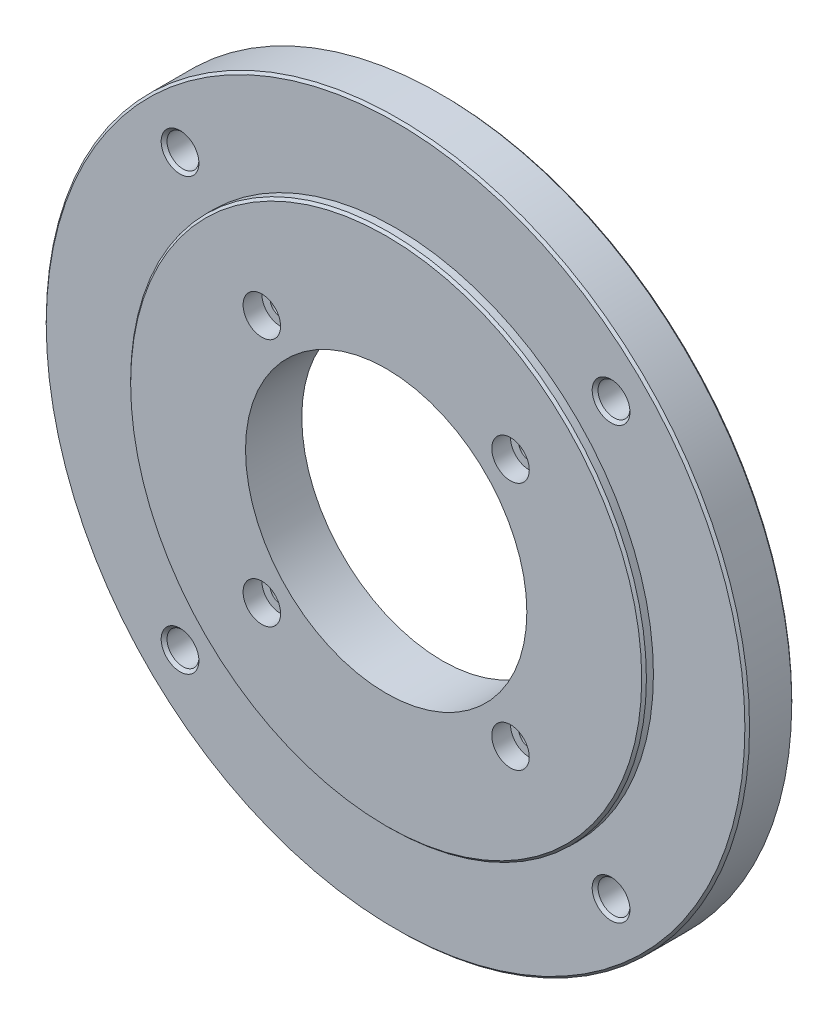
ISO-10303-21;
HEADER;
FILE_DESCRIPTION(('STEP AP214'),'2;1');
FILE_NAME('part.step','',(''),(''),'','','');
FILE_SCHEMA(('AUTOMOTIVE_DESIGN { 1 0 10303 214 1 1 1 1 }'));
ENDSEC;
DATA;
#1=APPLICATION_CONTEXT('core data for automotive mechanical design processes');
#2=APPLICATION_PROTOCOL_DEFINITION('international standard','automotive_design',2000,#1);
#3=PRODUCT_CONTEXT('',#1,'mechanical');
#4=PRODUCT('Part','Part','',(#3));
#5=PRODUCT_RELATED_PRODUCT_CATEGORY('part','',(#4));
#6=PRODUCT_DEFINITION_FORMATION('','',#4);
#7=PRODUCT_DEFINITION_CONTEXT('part definition',#1,'design');
#8=PRODUCT_DEFINITION('design','',#6,#7);
#9=PRODUCT_DEFINITION_SHAPE('','',#8);
#10=(LENGTH_UNIT() NAMED_UNIT(*) SI_UNIT(.MILLI.,.METRE.));
#11=(NAMED_UNIT(*) PLANE_ANGLE_UNIT() SI_UNIT($,.RADIAN.));
#12=(NAMED_UNIT(*) SI_UNIT($,.STERADIAN.) SOLID_ANGLE_UNIT());
#13=UNCERTAINTY_MEASURE_WITH_UNIT(LENGTH_MEASURE(1.E-05),#10,'distance_accuracy_value','');
#14=(GEOMETRIC_REPRESENTATION_CONTEXT(3) GLOBAL_UNCERTAINTY_ASSIGNED_CONTEXT((#13)) GLOBAL_UNIT_ASSIGNED_CONTEXT((#10,
#11,#12)) REPRESENTATION_CONTEXT('',''));
#15=CARTESIAN_POINT('',(0.,0.,0.));
#16=DIRECTION('',(0.,0.,1.));
#17=DIRECTION('',(1.,0.,0.));
#18=AXIS2_PLACEMENT_3D('',#15,#16,#17);
#19=CARTESIAN_POINT('',(0.,0.,10.));
#20=DIRECTION('',(0.,0.,-1.));
#21=DIRECTION('',(-1.,0.,0.));
#22=AXIS2_PLACEMENT_3D('',#19,#20,#21);
#23=CYLINDRICAL_SURFACE('',#22,75.);
#24=CARTESIAN_POINT('',(0.,0.,0.499999999999973));
#25=DIRECTION('',(0.,0.,1.));
#26=DIRECTION('',(1.,0.,0.));
#27=AXIS2_PLACEMENT_3D('',#24,#25,#26);
#28=CIRCLE('',#27,75.);
#29=CARTESIAN_POINT('',(75.,0.,0.499999999999973));
#30=VERTEX_POINT('',#29);
#31=EDGE_CURVE('E57',#30,#30,#28,.T.);
#32=ORIENTED_EDGE('',*,*,#31,.T.);
#33=EDGE_LOOP('',(#32));
#34=FACE_BOUND('',#33,.T.);
#35=CARTESIAN_POINT('',(0.,0.,9.49999999999999));
#36=DIRECTION('',(0.,0.,1.));
#37=DIRECTION('',(1.,0.,0.));
#38=AXIS2_PLACEMENT_3D('',#35,#36,#37);
#39=CIRCLE('',#38,75.);
#40=CARTESIAN_POINT('',(75.,0.,9.49999999999999));
#41=VERTEX_POINT('',#40);
#42=EDGE_CURVE('E60',#41,#41,#39,.F.);
#43=ORIENTED_EDGE('',*,*,#42,.T.);
#44=EDGE_LOOP('',(#43));
#45=FACE_BOUND('',#44,.T.);
#46=ADVANCED_FACE('F36',(#34,#45),#23,.T.);
#47=CARTESIAN_POINT('',(0.,0.,10.));
#48=DIRECTION('',(0.,0.,1.));
#49=DIRECTION('',(1.,0.,0.));
#50=AXIS2_PLACEMENT_3D('',#47,#48,#49);
#51=PLANE('',#50);
#52=CARTESIAN_POINT('',(0.,0.,10.));
#53=DIRECTION('',(0.,0.,1.));
#54=DIRECTION('',(1.,0.,0.));
#55=AXIS2_PLACEMENT_3D('',#52,#53,#54);
#56=CIRCLE('',#55,74.5);
#57=CARTESIAN_POINT('',(74.5,0.,10.));
#58=VERTEX_POINT('',#57);
#59=EDGE_CURVE('E48',#58,#58,#56,.T.);
#60=ORIENTED_EDGE('',*,*,#59,.T.);
#61=EDGE_LOOP('',(#60));
#62=FACE_BOUND('',#61,.T.);
#63=CARTESIAN_POINT('',(-45.9619407771255,45.9619407771257,10.));
#64=DIRECTION('',(0.,0.,1.));
#65=DIRECTION('',(1.,0.,0.));
#66=AXIS2_PLACEMENT_3D('',#63,#64,#65);
#67=CIRCLE('',#66,4.025);
#68=CARTESIAN_POINT('',(-41.9369407771255,45.9619407771257,10.));
#69=VERTEX_POINT('',#68);
#70=EDGE_CURVE('E99',#69,#69,#67,.T.);
#71=ORIENTED_EDGE('',*,*,#70,.F.);
#72=EDGE_LOOP('',(#71));
#73=FACE_BOUND('',#72,.T.);
#74=CARTESIAN_POINT('',(45.9619407771255,45.9619407771257,10.));
#75=DIRECTION('',(0.,0.,1.));
#76=DIRECTION('',(1.,0.,0.));
#77=AXIS2_PLACEMENT_3D('',#74,#75,#76);
#78=CIRCLE('',#77,4.025);
#79=CARTESIAN_POINT('',(49.9869407771255,45.9619407771257,10.));
#80=VERTEX_POINT('',#79);
#81=EDGE_CURVE('E90',#80,#80,#78,.T.);
#82=ORIENTED_EDGE('',*,*,#81,.F.);
#83=EDGE_LOOP('',(#82));
#84=FACE_BOUND('',#83,.T.);
#85=CARTESIAN_POINT('',(-45.9619407771255,-45.9619407771257,10.));
#86=DIRECTION('',(0.,0.,1.));
#87=DIRECTION('',(1.,0.,0.));
#88=AXIS2_PLACEMENT_3D('',#85,#86,#87);
#89=CIRCLE('',#88,4.025);
#90=CARTESIAN_POINT('',(-41.9369407771255,-45.9619407771257,10.));
#91=VERTEX_POINT('',#90);
#92=EDGE_CURVE('E81',#91,#91,#89,.T.);
#93=ORIENTED_EDGE('',*,*,#92,.F.);
#94=EDGE_LOOP('',(#93));
#95=FACE_BOUND('',#94,.T.);
#96=CARTESIAN_POINT('',(45.9619407771255,-45.9619407771257,10.));
#97=DIRECTION('',(0.,0.,1.));
#98=DIRECTION('',(1.,0.,0.));
#99=AXIS2_PLACEMENT_3D('',#96,#97,#98);
#100=CIRCLE('',#99,4.025);
#101=CARTESIAN_POINT('',(49.9869407771255,-45.9619407771257,10.));
#102=VERTEX_POINT('',#101);
#103=EDGE_CURVE('E72',#102,#102,#100,.T.);
#104=ORIENTED_EDGE('',*,*,#103,.F.);
#105=EDGE_LOOP('',(#104));
#106=FACE_BOUND('',#105,.T.);
#107=CARTESIAN_POINT('',(0.,0.,10.));
#108=DIRECTION('',(0.,0.,1.));
#109=DIRECTION('',(1.,0.,0.));
#110=AXIS2_PLACEMENT_3D('',#107,#108,#109);
#111=CIRCLE('',#110,55.);
#112=CARTESIAN_POINT('',(55.,0.,10.));
#113=VERTEX_POINT('',#112);
#114=EDGE_CURVE('E63',#113,#113,#111,.T.);
#115=ORIENTED_EDGE('',*,*,#114,.F.);
#116=EDGE_LOOP('',(#115));
#117=FACE_BOUND('',#116,.T.);
#118=ADVANCED_FACE('F183',(#62,#73,#84,#95,#106,#117),#51,.T.);
#119=CARTESIAN_POINT('',(0.,0.,0.));
#120=DIRECTION('',(0.,0.,1.));
#121=DIRECTION('',(1.,0.,0.));
#122=AXIS2_PLACEMENT_3D('',#119,#120,#121);
#123=PLANE('',#122);
#124=CARTESIAN_POINT('',(-26.5165042944955,26.5165042944956,0.));
#125=DIRECTION('',(0.,0.,1.));
#126=DIRECTION('',(1.,0.,0.));
#127=AXIS2_PLACEMENT_3D('',#124,#125,#126);
#128=CIRCLE('',#127,2.25);
#129=CARTESIAN_POINT('',(-24.2665042944955,26.5165042944956,0.));
#130=VERTEX_POINT('',#129);
#131=EDGE_CURVE('E144',#130,#130,#128,.T.);
#132=ORIENTED_EDGE('',*,*,#131,.T.);
#133=EDGE_LOOP('',(#132));
#134=FACE_BOUND('',#133,.T.);
#135=CARTESIAN_POINT('',(26.5165042944955,26.5165042944956,0.));
#136=DIRECTION('',(0.,0.,1.));
#137=DIRECTION('',(1.,0.,0.));
#138=AXIS2_PLACEMENT_3D('',#135,#136,#137);
#139=CIRCLE('',#138,2.25);
#140=CARTESIAN_POINT('',(28.7665042944955,26.5165042944956,0.));
#141=VERTEX_POINT('',#140);
#142=EDGE_CURVE('E132',#141,#141,#139,.T.);
#143=ORIENTED_EDGE('',*,*,#142,.T.);
#144=EDGE_LOOP('',(#143));
#145=FACE_BOUND('',#144,.T.);
#146=CARTESIAN_POINT('',(-26.5165042944955,-26.5165042944956,0.));
#147=DIRECTION('',(0.,0.,1.));
#148=DIRECTION('',(1.,0.,0.));
#149=AXIS2_PLACEMENT_3D('',#146,#147,#148);
#150=CIRCLE('',#149,2.25);
#151=CARTESIAN_POINT('',(-24.2665042944955,-26.5165042944956,0.));
#152=VERTEX_POINT('',#151);
#153=EDGE_CURVE('E120',#152,#152,#150,.T.);
#154=ORIENTED_EDGE('',*,*,#153,.T.);
#155=EDGE_LOOP('',(#154));
#156=FACE_BOUND('',#155,.T.);
#157=CARTESIAN_POINT('',(26.5165042944955,-26.5165042944956,0.));
#158=DIRECTION('',(0.,0.,1.));
#159=DIRECTION('',(1.,0.,0.));
#160=AXIS2_PLACEMENT_3D('',#157,#158,#159);
#161=CIRCLE('',#160,2.25);
#162=CARTESIAN_POINT('',(28.7665042944955,-26.5165042944956,0.));
#163=VERTEX_POINT('',#162);
#164=EDGE_CURVE('E106',#163,#163,#161,.T.);
#165=ORIENTED_EDGE('',*,*,#164,.T.);
#166=EDGE_LOOP('',(#165));
#167=FACE_BOUND('',#166,.T.);
#168=CARTESIAN_POINT('',(0.,0.,0.));
#169=DIRECTION('',(0.,0.,-1.));
#170=DIRECTION('',(-1.,0.,0.));
#171=AXIS2_PLACEMENT_3D('',#168,#169,#170);
#172=CIRCLE('',#171,30.);
#173=CARTESIAN_POINT('',(-30.,0.,0.));
#174=VERTEX_POINT('',#173);
#175=EDGE_CURVE('E103',#174,#174,#172,.T.);
#176=ORIENTED_EDGE('',*,*,#175,.F.);
#177=EDGE_LOOP('',(#176));
#178=FACE_BOUND('',#177,.T.);
#179=CARTESIAN_POINT('',(0.,0.,0.));
#180=DIRECTION('',(0.,0.,1.));
#181=DIRECTION('',(1.,0.,0.));
#182=AXIS2_PLACEMENT_3D('',#179,#180,#181);
#183=CIRCLE('',#182,74.5);
#184=CARTESIAN_POINT('',(74.5,0.,0.));
#185=VERTEX_POINT('',#184);
#186=EDGE_CURVE('E52',#185,#185,#183,.F.);
#187=ORIENTED_EDGE('',*,*,#186,.T.);
#188=EDGE_LOOP('',(#187));
#189=FACE_BOUND('',#188,.T.);
#190=CARTESIAN_POINT('',(-45.9619407771255,45.9619407771257,0.));
#191=DIRECTION('',(0.,0.,1.));
#192=DIRECTION('',(1.,0.,0.));
#193=AXIS2_PLACEMENT_3D('',#190,#191,#192);
#194=CIRCLE('',#193,3.4);
#195=CARTESIAN_POINT('',(-42.5619407771255,45.9619407771257,0.));
#196=VERTEX_POINT('',#195);
#197=EDGE_CURVE('E93',#196,#196,#194,.T.);
#198=ORIENTED_EDGE('',*,*,#197,.T.);
#199=EDGE_LOOP('',(#198));
#200=FACE_BOUND('',#199,.T.);
#201=CARTESIAN_POINT('',(45.9619407771255,45.9619407771257,0.));
#202=DIRECTION('',(0.,0.,1.));
#203=DIRECTION('',(1.,0.,0.));
#204=AXIS2_PLACEMENT_3D('',#201,#202,#203);
#205=CIRCLE('',#204,3.4);
#206=CARTESIAN_POINT('',(49.3619407771255,45.9619407771257,0.));
#207=VERTEX_POINT('',#206);
#208=EDGE_CURVE('E84',#207,#207,#205,.T.);
#209=ORIENTED_EDGE('',*,*,#208,.T.);
#210=EDGE_LOOP('',(#209));
#211=FACE_BOUND('',#210,.T.);
#212=CARTESIAN_POINT('',(-45.9619407771255,-45.9619407771257,0.));
#213=DIRECTION('',(0.,0.,1.));
#214=DIRECTION('',(1.,0.,0.));
#215=AXIS2_PLACEMENT_3D('',#212,#213,#214);
#216=CIRCLE('',#215,3.4);
#217=CARTESIAN_POINT('',(-42.5619407771255,-45.9619407771257,0.));
#218=VERTEX_POINT('',#217);
#219=EDGE_CURVE('E75',#218,#218,#216,.T.);
#220=ORIENTED_EDGE('',*,*,#219,.T.);
#221=EDGE_LOOP('',(#220));
#222=FACE_BOUND('',#221,.T.);
#223=CARTESIAN_POINT('',(45.9619407771255,-45.9619407771257,0.));
#224=DIRECTION('',(0.,0.,1.));
#225=DIRECTION('',(1.,0.,0.));
#226=AXIS2_PLACEMENT_3D('',#223,#224,#225);
#227=CIRCLE('',#226,3.4);
#228=CARTESIAN_POINT('',(49.3619407771255,-45.9619407771257,0.));
#229=VERTEX_POINT('',#228);
#230=EDGE_CURVE('E66',#229,#229,#227,.T.);
#231=ORIENTED_EDGE('',*,*,#230,.T.);
#232=EDGE_LOOP('',(#231));
#233=FACE_BOUND('',#232,.T.);
#234=ADVANCED_FACE('F180',(#134,#145,#156,#167,#178,#189,#200,#211,#222,#233),#123,.F.);
#235=CARTESIAN_POINT('',(0.,0.,12.));
#236=DIRECTION('',(0.,0.,-1.));
#237=DIRECTION('',(-1.,0.,0.));
#238=AXIS2_PLACEMENT_3D('',#235,#236,#237);
#239=CYLINDRICAL_SURFACE('',#238,55.);
#240=CARTESIAN_POINT('',(0.,0.,11.5));
#241=DIRECTION('',(0.,0.,1.));
#242=DIRECTION('',(1.,0.,0.));
#243=AXIS2_PLACEMENT_3D('',#240,#241,#242);
#244=CIRCLE('',#243,55.);
#245=CARTESIAN_POINT('',(55.,0.,11.5));
#246=VERTEX_POINT('',#245);
#247=EDGE_CURVE('E10',#246,#246,#244,.F.);
#248=ORIENTED_EDGE('',*,*,#247,.T.);
#249=EDGE_LOOP('',(#248));
#250=FACE_BOUND('',#249,.T.);
#251=ORIENTED_EDGE('',*,*,#114,.T.);
#252=EDGE_LOOP('',(#251));
#253=FACE_BOUND('',#252,.T.);
#254=ADVANCED_FACE('F163',(#250,#253),#239,.T.);
#255=CARTESIAN_POINT('',(0.,0.,12.));
#256=DIRECTION('',(0.,0.,1.));
#257=DIRECTION('',(1.,0.,0.));
#258=AXIS2_PLACEMENT_3D('',#255,#256,#257);
#259=PLANE('',#258);
#260=CARTESIAN_POINT('',(-26.5165042944955,26.5165042944956,12.));
#261=DIRECTION('',(0.,0.,1.));
#262=DIRECTION('',(1.,0.,0.));
#263=AXIS2_PLACEMENT_3D('',#260,#261,#262);
#264=CIRCLE('',#263,4.);
#265=CARTESIAN_POINT('',(-22.5165042944955,26.5165042944956,12.));
#266=VERTEX_POINT('',#265);
#267=EDGE_CURVE('E153',#266,#266,#264,.T.);
#268=ORIENTED_EDGE('',*,*,#267,.F.);
#269=EDGE_LOOP('',(#268));
#270=FACE_BOUND('',#269,.T.);
#271=CARTESIAN_POINT('',(26.5165042944955,26.5165042944956,12.));
#272=DIRECTION('',(0.,0.,1.));
#273=DIRECTION('',(1.,0.,0.));
#274=AXIS2_PLACEMENT_3D('',#271,#272,#273);
#275=CIRCLE('',#274,4.);
#276=CARTESIAN_POINT('',(30.5165042944955,26.5165042944956,12.));
#277=VERTEX_POINT('',#276);
#278=EDGE_CURVE('E141',#277,#277,#275,.T.);
#279=ORIENTED_EDGE('',*,*,#278,.F.);
#280=EDGE_LOOP('',(#279));
#281=FACE_BOUND('',#280,.T.);
#282=CARTESIAN_POINT('',(-26.5165042944955,-26.5165042944956,12.));
#283=DIRECTION('',(0.,0.,1.));
#284=DIRECTION('',(1.,0.,0.));
#285=AXIS2_PLACEMENT_3D('',#282,#283,#284);
#286=CIRCLE('',#285,4.);
#287=CARTESIAN_POINT('',(-22.5165042944955,-26.5165042944956,12.));
#288=VERTEX_POINT('',#287);
#289=EDGE_CURVE('E129',#288,#288,#286,.T.);
#290=ORIENTED_EDGE('',*,*,#289,.F.);
#291=EDGE_LOOP('',(#290));
#292=FACE_BOUND('',#291,.T.);
#293=CARTESIAN_POINT('',(26.5165042944955,-26.5165042944956,12.));
#294=DIRECTION('',(0.,0.,1.));
#295=DIRECTION('',(1.,0.,0.));
#296=AXIS2_PLACEMENT_3D('',#293,#294,#295);
#297=CIRCLE('',#296,4.);
#298=CARTESIAN_POINT('',(30.5165042944955,-26.5165042944956,12.));
#299=VERTEX_POINT('',#298);
#300=EDGE_CURVE('E117',#299,#299,#297,.T.);
#301=ORIENTED_EDGE('',*,*,#300,.F.);
#302=EDGE_LOOP('',(#301));
#303=FACE_BOUND('',#302,.T.);
#304=CARTESIAN_POINT('',(0.,0.,12.));
#305=DIRECTION('',(0.,0.,-1.));
#306=DIRECTION('',(-1.,0.,0.));
#307=AXIS2_PLACEMENT_3D('',#304,#305,#306);
#308=CIRCLE('',#307,30.);
#309=CARTESIAN_POINT('',(-30.,0.,12.));
#310=VERTEX_POINT('',#309);
#311=EDGE_CURVE('E102',#310,#310,#308,.T.);
#312=ORIENTED_EDGE('',*,*,#311,.T.);
#313=EDGE_LOOP('',(#312));
#314=FACE_BOUND('',#313,.T.);
#315=CARTESIAN_POINT('',(0.,0.,12.));
#316=DIRECTION('',(0.,0.,1.));
#317=DIRECTION('',(1.,0.,0.));
#318=AXIS2_PLACEMENT_3D('',#315,#316,#317);
#319=CIRCLE('',#318,54.5);
#320=CARTESIAN_POINT('',(54.5,0.,12.));
#321=VERTEX_POINT('',#320);
#322=EDGE_CURVE('E44',#321,#321,#319,.T.);
#323=ORIENTED_EDGE('',*,*,#322,.T.);
#324=EDGE_LOOP('',(#323));
#325=FACE_BOUND('',#324,.T.);
#326=ADVANCED_FACE('F159',(#270,#281,#292,#303,#314,#325),#259,.T.);
#327=CARTESIAN_POINT('',(45.9619407771255,-45.9619407771257,10.));
#328=DIRECTION('',(0.,0.,1.));
#329=DIRECTION('',(1.,0.,0.));
#330=AXIS2_PLACEMENT_3D('',#327,#328,#329);
#331=CYLINDRICAL_SURFACE('',#330,3.4);
#332=ORIENTED_EDGE('',*,*,#230,.F.);
#333=EDGE_LOOP('',(#332));
#334=FACE_BOUND('',#333,.T.);
#335=CARTESIAN_POINT('',(45.9619407771255,-45.9619407771257,9.375));
#336=DIRECTION('',(0.,0.,1.));
#337=DIRECTION('',(1.,0.,0.));
#338=AXIS2_PLACEMENT_3D('',#335,#336,#337);
#339=CIRCLE('',#338,3.4);
#340=CARTESIAN_POINT('',(49.3619407771255,-45.9619407771257,9.375));
#341=VERTEX_POINT('',#340);
#342=EDGE_CURVE('E69',#341,#341,#339,.T.);
#343=ORIENTED_EDGE('',*,*,#342,.T.);
#344=EDGE_LOOP('',(#343));
#345=FACE_BOUND('',#344,.T.);
#346=ADVANCED_FACE('F162',(#334,#345),#331,.F.);
#347=CARTESIAN_POINT('',(45.9619407771255,-45.9619407771257,10.));
#348=DIRECTION('',(0.,0.,1.));
#349=DIRECTION('',(1.,0.,0.));
#350=AXIS2_PLACEMENT_3D('',#347,#348,#349);
#351=CONICAL_SURFACE('',#350,4.025,0.785398163397446);
#352=ORIENTED_EDGE('',*,*,#342,.F.);
#353=EDGE_LOOP('',(#352));
#354=FACE_BOUND('',#353,.T.);
#355=ORIENTED_EDGE('',*,*,#103,.T.);
#356=EDGE_LOOP('',(#355));
#357=FACE_BOUND('',#356,.T.);
#358=ADVANCED_FACE('F198',(#354,#357),#351,.F.);
#359=CARTESIAN_POINT('',(-45.9619407771255,-45.9619407771257,10.));
#360=DIRECTION('',(0.,0.,1.));
#361=DIRECTION('',(1.,0.,0.));
#362=AXIS2_PLACEMENT_3D('',#359,#360,#361);
#363=CYLINDRICAL_SURFACE('',#362,3.4);
#364=ORIENTED_EDGE('',*,*,#219,.F.);
#365=EDGE_LOOP('',(#364));
#366=FACE_BOUND('',#365,.T.);
#367=CARTESIAN_POINT('',(-45.9619407771255,-45.9619407771257,9.375));
#368=DIRECTION('',(0.,0.,1.));
#369=DIRECTION('',(1.,0.,0.));
#370=AXIS2_PLACEMENT_3D('',#367,#368,#369);
#371=CIRCLE('',#370,3.4);
#372=CARTESIAN_POINT('',(-42.5619407771255,-45.9619407771257,9.375));
#373=VERTEX_POINT('',#372);
#374=EDGE_CURVE('E78',#373,#373,#371,.T.);
#375=ORIENTED_EDGE('',*,*,#374,.T.);
#376=EDGE_LOOP('',(#375));
#377=FACE_BOUND('',#376,.T.);
#378=ADVANCED_FACE('F204',(#366,#377),#363,.F.);
#379=CARTESIAN_POINT('',(-45.9619407771255,-45.9619407771257,10.));
#380=DIRECTION('',(0.,0.,1.));
#381=DIRECTION('',(1.,0.,0.));
#382=AXIS2_PLACEMENT_3D('',#379,#380,#381);
#383=CONICAL_SURFACE('',#382,4.025,0.785398163397446);
#384=ORIENTED_EDGE('',*,*,#374,.F.);
#385=EDGE_LOOP('',(#384));
#386=FACE_BOUND('',#385,.T.);
#387=ORIENTED_EDGE('',*,*,#92,.T.);
#388=EDGE_LOOP('',(#387));
#389=FACE_BOUND('',#388,.T.);
#390=ADVANCED_FACE('F252',(#386,#389),#383,.F.);
#391=CARTESIAN_POINT('',(45.9619407771255,45.9619407771257,10.));
#392=DIRECTION('',(0.,0.,1.));
#393=DIRECTION('',(1.,0.,0.));
#394=AXIS2_PLACEMENT_3D('',#391,#392,#393);
#395=CYLINDRICAL_SURFACE('',#394,3.4);
#396=ORIENTED_EDGE('',*,*,#208,.F.);
#397=EDGE_LOOP('',(#396));
#398=FACE_BOUND('',#397,.T.);
#399=CARTESIAN_POINT('',(45.9619407771255,45.9619407771257,9.375));
#400=DIRECTION('',(0.,0.,1.));
#401=DIRECTION('',(1.,0.,0.));
#402=AXIS2_PLACEMENT_3D('',#399,#400,#401);
#403=CIRCLE('',#402,3.4);
#404=CARTESIAN_POINT('',(49.3619407771255,45.9619407771257,9.375));
#405=VERTEX_POINT('',#404);
#406=EDGE_CURVE('E87',#405,#405,#403,.T.);
#407=ORIENTED_EDGE('',*,*,#406,.T.);
#408=EDGE_LOOP('',(#407));
#409=FACE_BOUND('',#408,.T.);
#410=ADVANCED_FACE('F254',(#398,#409),#395,.F.);
#411=CARTESIAN_POINT('',(45.9619407771255,45.9619407771257,10.));
#412=DIRECTION('',(0.,0.,1.));
#413=DIRECTION('',(1.,0.,0.));
#414=AXIS2_PLACEMENT_3D('',#411,#412,#413);
#415=CONICAL_SURFACE('',#414,4.025,0.785398163397446);
#416=ORIENTED_EDGE('',*,*,#406,.F.);
#417=EDGE_LOOP('',(#416));
#418=FACE_BOUND('',#417,.T.);
#419=ORIENTED_EDGE('',*,*,#81,.T.);
#420=EDGE_LOOP('',(#419));
#421=FACE_BOUND('',#420,.T.);
#422=ADVANCED_FACE('F261',(#418,#421),#415,.F.);
#423=CARTESIAN_POINT('',(-45.9619407771255,45.9619407771257,10.));
#424=DIRECTION('',(0.,0.,1.));
#425=DIRECTION('',(1.,0.,0.));
#426=AXIS2_PLACEMENT_3D('',#423,#424,#425);
#427=CYLINDRICAL_SURFACE('',#426,3.4);
#428=ORIENTED_EDGE('',*,*,#197,.F.);
#429=EDGE_LOOP('',(#428));
#430=FACE_BOUND('',#429,.T.);
#431=CARTESIAN_POINT('',(-45.9619407771255,45.9619407771257,9.375));
#432=DIRECTION('',(0.,0.,1.));
#433=DIRECTION('',(1.,0.,0.));
#434=AXIS2_PLACEMENT_3D('',#431,#432,#433);
#435=CIRCLE('',#434,3.4);
#436=CARTESIAN_POINT('',(-42.5619407771255,45.9619407771257,9.375));
#437=VERTEX_POINT('',#436);
#438=EDGE_CURVE('E96',#437,#437,#435,.T.);
#439=ORIENTED_EDGE('',*,*,#438,.T.);
#440=EDGE_LOOP('',(#439));
#441=FACE_BOUND('',#440,.T.);
#442=ADVANCED_FACE('F270',(#430,#441),#427,.F.);
#443=CARTESIAN_POINT('',(-45.9619407771255,45.9619407771257,10.));
#444=DIRECTION('',(0.,0.,1.));
#445=DIRECTION('',(1.,0.,0.));
#446=AXIS2_PLACEMENT_3D('',#443,#444,#445);
#447=CONICAL_SURFACE('',#446,4.025,0.785398163397446);
#448=ORIENTED_EDGE('',*,*,#438,.F.);
#449=EDGE_LOOP('',(#448));
#450=FACE_BOUND('',#449,.T.);
#451=ORIENTED_EDGE('',*,*,#70,.T.);
#452=EDGE_LOOP('',(#451));
#453=FACE_BOUND('',#452,.T.);
#454=ADVANCED_FACE('F232',(#450,#453),#447,.F.);
#455=CARTESIAN_POINT('',(0.,0.,0.499999999999973));
#456=DIRECTION('',(0.,0.,1.));
#457=DIRECTION('',(1.,0.,0.));
#458=AXIS2_PLACEMENT_3D('',#455,#456,#457);
#459=CONICAL_SURFACE('',#458,75.,0.785398163397448);
#460=ORIENTED_EDGE('',*,*,#186,.F.);
#461=EDGE_LOOP('',(#460));
#462=FACE_BOUND('',#461,.T.);
#463=ORIENTED_EDGE('',*,*,#31,.F.);
#464=EDGE_LOOP('',(#463));
#465=FACE_BOUND('',#464,.T.);
#466=ADVANCED_FACE('F226',(#462,#465),#459,.T.);
#467=CARTESIAN_POINT('',(0.,0.,10.));
#468=DIRECTION('',(0.,0.,-1.));
#469=DIRECTION('',(-1.,0.,0.));
#470=AXIS2_PLACEMENT_3D('',#467,#468,#469);
#471=CONICAL_SURFACE('',#470,74.5,0.785398163397462);
#472=ORIENTED_EDGE('',*,*,#42,.F.);
#473=EDGE_LOOP('',(#472));
#474=FACE_BOUND('',#473,.T.);
#475=ORIENTED_EDGE('',*,*,#59,.F.);
#476=EDGE_LOOP('',(#475));
#477=FACE_BOUND('',#476,.T.);
#478=ADVANCED_FACE('F231',(#474,#477),#471,.T.);
#479=CARTESIAN_POINT('',(0.,0.,12.));
#480=DIRECTION('',(0.,0.,-1.));
#481=DIRECTION('',(-1.,0.,0.));
#482=AXIS2_PLACEMENT_3D('',#479,#480,#481);
#483=CONICAL_SURFACE('',#482,54.5,0.785398163397441);
#484=ORIENTED_EDGE('',*,*,#247,.F.);
#485=EDGE_LOOP('',(#484));
#486=FACE_BOUND('',#485,.T.);
#487=ORIENTED_EDGE('',*,*,#322,.F.);
#488=EDGE_LOOP('',(#487));
#489=FACE_BOUND('',#488,.T.);
#490=ADVANCED_FACE('F39',(#486,#489),#483,.T.);
#491=CARTESIAN_POINT('',(0.,0.,12.));
#492=DIRECTION('',(0.,0.,-1.));
#493=DIRECTION('',(-1.,0.,0.));
#494=AXIS2_PLACEMENT_3D('',#491,#492,#493);
#495=CYLINDRICAL_SURFACE('',#494,30.);
#496=ORIENTED_EDGE('',*,*,#311,.F.);
#497=EDGE_LOOP('',(#496));
#498=FACE_BOUND('',#497,.T.);
#499=ORIENTED_EDGE('',*,*,#175,.T.);
#500=EDGE_LOOP('',(#499));
#501=FACE_BOUND('',#500,.T.);
#502=ADVANCED_FACE('F173',(#498,#501),#495,.F.);
#503=CARTESIAN_POINT('',(26.5165042944955,-26.5165042944956,12.));
#504=DIRECTION('',(0.,0.,1.));
#505=DIRECTION('',(1.,0.,0.));
#506=AXIS2_PLACEMENT_3D('',#503,#504,#505);
#507=CYLINDRICAL_SURFACE('',#506,2.25);
#508=ORIENTED_EDGE('',*,*,#164,.F.);
#509=EDGE_LOOP('',(#508));
#510=FACE_BOUND('',#509,.T.);
#511=CARTESIAN_POINT('',(26.5165042944955,-26.5165042944956,8.));
#512=DIRECTION('',(0.,0.,1.));
#513=DIRECTION('',(1.,0.,0.));
#514=AXIS2_PLACEMENT_3D('',#511,#512,#513);
#515=CIRCLE('',#514,2.25);
#516=CARTESIAN_POINT('',(28.7665042944955,-26.5165042944956,8.));
#517=VERTEX_POINT('',#516);
#518=EDGE_CURVE('E111',#517,#517,#515,.T.);
#519=ORIENTED_EDGE('',*,*,#518,.T.);
#520=EDGE_LOOP('',(#519));
#521=FACE_BOUND('',#520,.T.);
#522=ADVANCED_FACE('F176',(#510,#521),#507,.F.);
#523=CARTESIAN_POINT('',(28.7665042944955,-26.5165042944956,8.));
#524=DIRECTION('',(0.,0.,-1.));
#525=DIRECTION('',(-1.,0.,0.));
#526=AXIS2_PLACEMENT_3D('',#523,#524,#525);
#527=PLANE('',#526);
#528=ORIENTED_EDGE('',*,*,#518,.F.);
#529=EDGE_LOOP('',(#528));
#530=FACE_BOUND('',#529,.T.);
#531=CARTESIAN_POINT('',(26.5165042944955,-26.5165042944956,8.));
#532=DIRECTION('',(0.,0.,1.));
#533=DIRECTION('',(1.,0.,0.));
#534=AXIS2_PLACEMENT_3D('',#531,#532,#533);
#535=CIRCLE('',#534,4.);
#536=CARTESIAN_POINT('',(30.5165042944955,-26.5165042944956,8.));
#537=VERTEX_POINT('',#536);
#538=EDGE_CURVE('E114',#537,#537,#535,.T.);
#539=ORIENTED_EDGE('',*,*,#538,.T.);
#540=EDGE_LOOP('',(#539));
#541=FACE_BOUND('',#540,.T.);
#542=ADVANCED_FACE('F280',(#530,#541),#527,.F.);
#543=CARTESIAN_POINT('',(26.5165042944955,-26.5165042944956,12.));
#544=DIRECTION('',(0.,0.,1.));
#545=DIRECTION('',(1.,0.,0.));
#546=AXIS2_PLACEMENT_3D('',#543,#544,#545);
#547=CYLINDRICAL_SURFACE('',#546,4.);
#548=ORIENTED_EDGE('',*,*,#538,.F.);
#549=EDGE_LOOP('',(#548));
#550=FACE_BOUND('',#549,.T.);
#551=ORIENTED_EDGE('',*,*,#300,.T.);
#552=EDGE_LOOP('',(#551));
#553=FACE_BOUND('',#552,.T.);
#554=ADVANCED_FACE('F284',(#550,#553),#547,.F.);
#555=CARTESIAN_POINT('',(-26.5165042944955,-26.5165042944956,12.));
#556=DIRECTION('',(0.,0.,1.));
#557=DIRECTION('',(1.,0.,0.));
#558=AXIS2_PLACEMENT_3D('',#555,#556,#557);
#559=CYLINDRICAL_SURFACE('',#558,2.25);
#560=ORIENTED_EDGE('',*,*,#153,.F.);
#561=EDGE_LOOP('',(#560));
#562=FACE_BOUND('',#561,.T.);
#563=CARTESIAN_POINT('',(-26.5165042944955,-26.5165042944956,8.));
#564=DIRECTION('',(0.,0.,1.));
#565=DIRECTION('',(1.,0.,0.));
#566=AXIS2_PLACEMENT_3D('',#563,#564,#565);
#567=CIRCLE('',#566,2.25);
#568=CARTESIAN_POINT('',(-24.2665042944955,-26.5165042944956,8.));
#569=VERTEX_POINT('',#568);
#570=EDGE_CURVE('E123',#569,#569,#567,.T.);
#571=ORIENTED_EDGE('',*,*,#570,.T.);
#572=EDGE_LOOP('',(#571));
#573=FACE_BOUND('',#572,.T.);
#574=ADVANCED_FACE('F288',(#562,#573),#559,.F.);
#575=CARTESIAN_POINT('',(-24.2665042944955,-26.5165042944956,8.));
#576=DIRECTION('',(0.,0.,-1.));
#577=DIRECTION('',(-1.,0.,0.));
#578=AXIS2_PLACEMENT_3D('',#575,#576,#577);
#579=PLANE('',#578);
#580=ORIENTED_EDGE('',*,*,#570,.F.);
#581=EDGE_LOOP('',(#580));
#582=FACE_BOUND('',#581,.T.);
#583=CARTESIAN_POINT('',(-26.5165042944955,-26.5165042944956,8.));
#584=DIRECTION('',(0.,0.,1.));
#585=DIRECTION('',(1.,0.,0.));
#586=AXIS2_PLACEMENT_3D('',#583,#584,#585);
#587=CIRCLE('',#586,4.);
#588=CARTESIAN_POINT('',(-22.5165042944955,-26.5165042944956,8.));
#589=VERTEX_POINT('',#588);
#590=EDGE_CURVE('E126',#589,#589,#587,.T.);
#591=ORIENTED_EDGE('',*,*,#590,.T.);
#592=EDGE_LOOP('',(#591));
#593=FACE_BOUND('',#592,.T.);
#594=ADVANCED_FACE('F292',(#582,#593),#579,.F.);
#595=CARTESIAN_POINT('',(-26.5165042944955,-26.5165042944956,12.));
#596=DIRECTION('',(0.,0.,1.));
#597=DIRECTION('',(1.,0.,0.));
#598=AXIS2_PLACEMENT_3D('',#595,#596,#597);
#599=CYLINDRICAL_SURFACE('',#598,4.);
#600=ORIENTED_EDGE('',*,*,#590,.F.);
#601=EDGE_LOOP('',(#600));
#602=FACE_BOUND('',#601,.T.);
#603=ORIENTED_EDGE('',*,*,#289,.T.);
#604=EDGE_LOOP('',(#603));
#605=FACE_BOUND('',#604,.T.);
#606=ADVANCED_FACE('F296',(#602,#605),#599,.F.);
#607=CARTESIAN_POINT('',(26.5165042944955,26.5165042944956,12.));
#608=DIRECTION('',(0.,0.,1.));
#609=DIRECTION('',(1.,0.,0.));
#610=AXIS2_PLACEMENT_3D('',#607,#608,#609);
#611=CYLINDRICAL_SURFACE('',#610,2.25);
#612=ORIENTED_EDGE('',*,*,#142,.F.);
#613=EDGE_LOOP('',(#612));
#614=FACE_BOUND('',#613,.T.);
#615=CARTESIAN_POINT('',(26.5165042944955,26.5165042944956,8.));
#616=DIRECTION('',(0.,0.,1.));
#617=DIRECTION('',(1.,0.,0.));
#618=AXIS2_PLACEMENT_3D('',#615,#616,#617);
#619=CIRCLE('',#618,2.25);
#620=CARTESIAN_POINT('',(28.7665042944955,26.5165042944956,8.));
#621=VERTEX_POINT('',#620);
#622=EDGE_CURVE('E135',#621,#621,#619,.T.);
#623=ORIENTED_EDGE('',*,*,#622,.T.);
#624=EDGE_LOOP('',(#623));
#625=FACE_BOUND('',#624,.T.);
#626=ADVANCED_FACE('F300',(#614,#625),#611,.F.);
#627=CARTESIAN_POINT('',(28.7665042944955,26.5165042944956,8.));
#628=DIRECTION('',(0.,0.,-1.));
#629=DIRECTION('',(-1.,0.,0.));
#630=AXIS2_PLACEMENT_3D('',#627,#628,#629);
#631=PLANE('',#630);
#632=ORIENTED_EDGE('',*,*,#622,.F.);
#633=EDGE_LOOP('',(#632));
#634=FACE_BOUND('',#633,.T.);
#635=CARTESIAN_POINT('',(26.5165042944955,26.5165042944956,8.));
#636=DIRECTION('',(0.,0.,1.));
#637=DIRECTION('',(1.,0.,0.));
#638=AXIS2_PLACEMENT_3D('',#635,#636,#637);
#639=CIRCLE('',#638,4.);
#640=CARTESIAN_POINT('',(30.5165042944955,26.5165042944956,8.));
#641=VERTEX_POINT('',#640);
#642=EDGE_CURVE('E138',#641,#641,#639,.T.);
#643=ORIENTED_EDGE('',*,*,#642,.T.);
#644=EDGE_LOOP('',(#643));
#645=FACE_BOUND('',#644,.T.);
#646=ADVANCED_FACE('F304',(#634,#645),#631,.F.);
#647=CARTESIAN_POINT('',(26.5165042944955,26.5165042944956,12.));
#648=DIRECTION('',(0.,0.,1.));
#649=DIRECTION('',(1.,0.,0.));
#650=AXIS2_PLACEMENT_3D('',#647,#648,#649);
#651=CYLINDRICAL_SURFACE('',#650,4.);
#652=ORIENTED_EDGE('',*,*,#642,.F.);
#653=EDGE_LOOP('',(#652));
#654=FACE_BOUND('',#653,.T.);
#655=ORIENTED_EDGE('',*,*,#278,.T.);
#656=EDGE_LOOP('',(#655));
#657=FACE_BOUND('',#656,.T.);
#658=ADVANCED_FACE('F308',(#654,#657),#651,.F.);
#659=CARTESIAN_POINT('',(-26.5165042944955,26.5165042944956,12.));
#660=DIRECTION('',(0.,0.,1.));
#661=DIRECTION('',(1.,0.,0.));
#662=AXIS2_PLACEMENT_3D('',#659,#660,#661);
#663=CYLINDRICAL_SURFACE('',#662,2.25);
#664=ORIENTED_EDGE('',*,*,#131,.F.);
#665=EDGE_LOOP('',(#664));
#666=FACE_BOUND('',#665,.T.);
#667=CARTESIAN_POINT('',(-26.5165042944955,26.5165042944956,8.));
#668=DIRECTION('',(0.,0.,1.));
#669=DIRECTION('',(1.,0.,0.));
#670=AXIS2_PLACEMENT_3D('',#667,#668,#669);
#671=CIRCLE('',#670,2.25);
#672=CARTESIAN_POINT('',(-24.2665042944955,26.5165042944956,8.));
#673=VERTEX_POINT('',#672);
#674=EDGE_CURVE('E147',#673,#673,#671,.T.);
#675=ORIENTED_EDGE('',*,*,#674,.T.);
#676=EDGE_LOOP('',(#675));
#677=FACE_BOUND('',#676,.T.);
#678=ADVANCED_FACE('F312',(#666,#677),#663,.F.);
#679=CARTESIAN_POINT('',(-24.2665042944955,26.5165042944956,8.));
#680=DIRECTION('',(0.,0.,-1.));
#681=DIRECTION('',(-1.,0.,0.));
#682=AXIS2_PLACEMENT_3D('',#679,#680,#681);
#683=PLANE('',#682);
#684=ORIENTED_EDGE('',*,*,#674,.F.);
#685=EDGE_LOOP('',(#684));
#686=FACE_BOUND('',#685,.T.);
#687=CARTESIAN_POINT('',(-26.5165042944955,26.5165042944956,8.));
#688=DIRECTION('',(0.,0.,1.));
#689=DIRECTION('',(1.,0.,0.));
#690=AXIS2_PLACEMENT_3D('',#687,#688,#689);
#691=CIRCLE('',#690,4.);
#692=CARTESIAN_POINT('',(-22.5165042944955,26.5165042944956,8.));
#693=VERTEX_POINT('',#692);
#694=EDGE_CURVE('E150',#693,#693,#691,.T.);
#695=ORIENTED_EDGE('',*,*,#694,.T.);
#696=EDGE_LOOP('',(#695));
#697=FACE_BOUND('',#696,.T.);
#698=ADVANCED_FACE('F316',(#686,#697),#683,.F.);
#699=CARTESIAN_POINT('',(-26.5165042944955,26.5165042944956,12.));
#700=DIRECTION('',(0.,0.,1.));
#701=DIRECTION('',(1.,0.,0.));
#702=AXIS2_PLACEMENT_3D('',#699,#700,#701);
#703=CYLINDRICAL_SURFACE('',#702,4.);
#704=ORIENTED_EDGE('',*,*,#694,.F.);
#705=EDGE_LOOP('',(#704));
#706=FACE_BOUND('',#705,.T.);
#707=ORIENTED_EDGE('',*,*,#267,.T.);
#708=EDGE_LOOP('',(#707));
#709=FACE_BOUND('',#708,.T.);
#710=ADVANCED_FACE('F157',(#706,#709),#703,.F.);
#711=CLOSED_SHELL('',(#46,#118,#234,#254,#326,#346,#358,#378,#390,#410,#422,#442,#454,#466,#478,
#490,#502,#522,#542,#554,#574,#594,#606,#626,#646,#658,#678,#698,#710));
#712=MANIFOLD_SOLID_BREP('B2',#711);
#713=ADVANCED_BREP_SHAPE_REPRESENTATION('',(#18,#712),#14);
#714=SHAPE_DEFINITION_REPRESENTATION(#9,#713);
ENDSEC;
END-ISO-10303-21;
